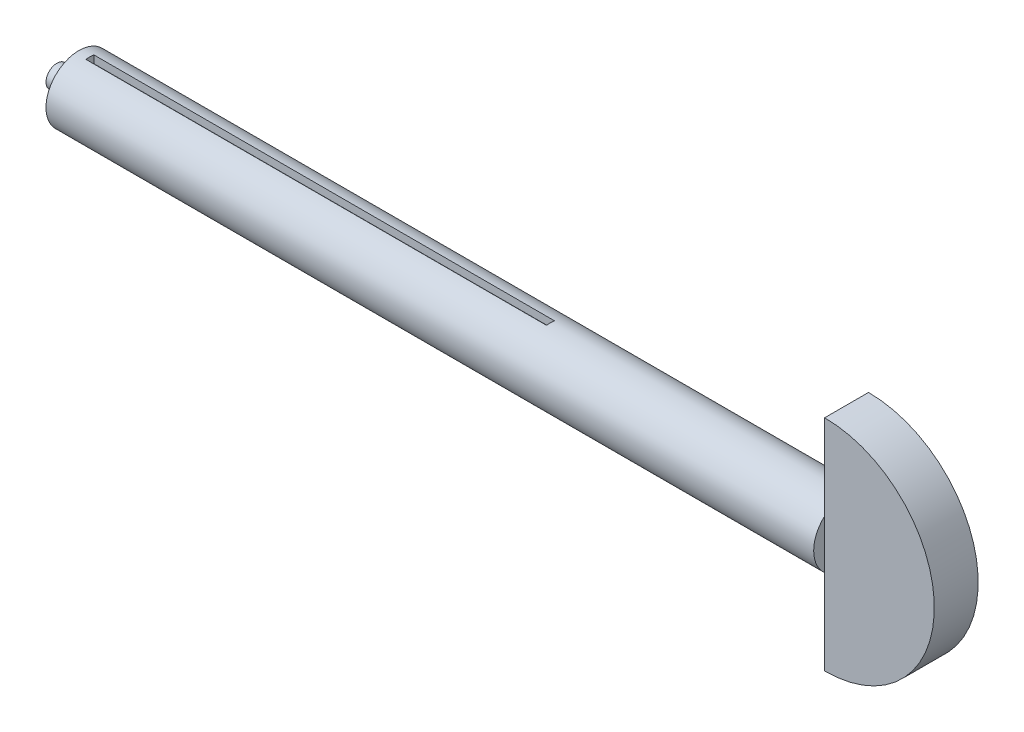
ISO-10303-21;
HEADER;
FILE_DESCRIPTION(('STEP AP214'),'2;1');
FILE_NAME('part.step','',(''),(''),'','','');
FILE_SCHEMA(('AUTOMOTIVE_DESIGN { 1 0 10303 214 1 1 1 1 }'));
ENDSEC;
DATA;
#1=APPLICATION_CONTEXT('core data for automotive mechanical design processes');
#2=APPLICATION_PROTOCOL_DEFINITION('international standard','automotive_design',2000,#1);
#3=PRODUCT_CONTEXT('',#1,'mechanical');
#4=PRODUCT('Part','Part','',(#3));
#5=PRODUCT_RELATED_PRODUCT_CATEGORY('part','',(#4));
#6=PRODUCT_DEFINITION_FORMATION('','',#4);
#7=PRODUCT_DEFINITION_CONTEXT('part definition',#1,'design');
#8=PRODUCT_DEFINITION('design','',#6,#7);
#9=PRODUCT_DEFINITION_SHAPE('','',#8);
#10=(LENGTH_UNIT() NAMED_UNIT(*) SI_UNIT(.MILLI.,.METRE.));
#11=(NAMED_UNIT(*) PLANE_ANGLE_UNIT() SI_UNIT($,.RADIAN.));
#12=(NAMED_UNIT(*) SI_UNIT($,.STERADIAN.) SOLID_ANGLE_UNIT());
#13=UNCERTAINTY_MEASURE_WITH_UNIT(LENGTH_MEASURE(1.E-05),#10,'distance_accuracy_value','');
#14=(GEOMETRIC_REPRESENTATION_CONTEXT(3) GLOBAL_UNCERTAINTY_ASSIGNED_CONTEXT((#13)) GLOBAL_UNIT_ASSIGNED_CONTEXT((#10,
#11,#12)) REPRESENTATION_CONTEXT('',''));
#15=CARTESIAN_POINT('',(0.,0.,0.));
#16=DIRECTION('',(0.,0.,1.));
#17=DIRECTION('',(1.,0.,0.));
#18=AXIS2_PLACEMENT_3D('',#15,#16,#17);
#19=CARTESIAN_POINT('',(180.,0.,0.));
#20=DIRECTION('',(-1.,0.,0.));
#21=DIRECTION('',(0.,0.,1.));
#22=AXIS2_PLACEMENT_3D('',#19,#20,#21);
#23=CYLINDRICAL_SURFACE('',#22,7.5);
#24=DIRECTION('',(-1.,0.,0.));
#25=VECTOR('',#24,1.);
#26=CARTESIAN_POINT('',(180.,-7.44580418759451,0.9));
#27=LINE('',#26,#25);
#28=CARTESIAN_POINT('',(7.5,-7.44580418759451,0.9));
#29=VERTEX_POINT('',#28);
#30=CARTESIAN_POINT('',(112.5,-7.44580418759451,0.9));
#31=VERTEX_POINT('',#30);
#32=EDGE_CURVE('E13',#29,#31,#27,.F.);
#33=ORIENTED_EDGE('',*,*,#32,.T.);
#34=CARTESIAN_POINT('',(112.5,0.,0.));
#35=DIRECTION('',(1.,0.,0.));
#36=DIRECTION('',(0.,0.,-1.));
#37=AXIS2_PLACEMENT_3D('',#34,#35,#36);
#38=CIRCLE('',#37,7.5);
#39=CARTESIAN_POINT('',(112.5,-7.44580418759451,-0.9));
#40=VERTEX_POINT('',#39);
#41=EDGE_CURVE('E66',#31,#40,#38,.T.);
#42=ORIENTED_EDGE('',*,*,#41,.T.);
#43=DIRECTION('',(-1.,0.,0.));
#44=VECTOR('',#43,1.);
#45=CARTESIAN_POINT('',(180.,-7.44580418759451,-0.9));
#46=LINE('',#45,#44);
#47=CARTESIAN_POINT('',(7.5,-7.44580418759451,-0.9));
#48=VERTEX_POINT('',#47);
#49=EDGE_CURVE('E275',#40,#48,#46,.T.);
#50=ORIENTED_EDGE('',*,*,#49,.T.);
#51=CARTESIAN_POINT('',(7.50000000000001,0.,0.));
#52=DIRECTION('',(-1.,0.,0.));
#53=DIRECTION('',(0.,0.,1.));
#54=AXIS2_PLACEMENT_3D('',#51,#52,#53);
#55=CIRCLE('',#54,7.5);
#56=EDGE_CURVE('E59',#48,#29,#55,.T.);
#57=ORIENTED_EDGE('',*,*,#56,.T.);
#58=EDGE_LOOP('',(#33,#42,#50,#57));
#59=FACE_BOUND('',#58,.T.);
#60=CARTESIAN_POINT('',(180.,0.,0.));
#61=DIRECTION('',(1.,0.,0.));
#62=DIRECTION('',(0.,0.,-1.));
#63=AXIS2_PLACEMENT_3D('',#60,#61,#62);
#64=CIRCLE('',#63,7.5);
#65=CARTESIAN_POINT('',(180.,5.59016994374947,-5.));
#66=VERTEX_POINT('',#65);
#67=CARTESIAN_POINT('',(180.,5.59016994374947,5.));
#68=VERTEX_POINT('',#67);
#69=EDGE_CURVE('E236',#66,#68,#64,.T.);
#70=ORIENTED_EDGE('',*,*,#69,.F.);
#71=CARTESIAN_POINT('',(180.,-5.59016994374947,-5.));
#72=VERTEX_POINT('',#71);
#73=EDGE_CURVE('E242',#72,#66,#64,.T.);
#74=ORIENTED_EDGE('',*,*,#73,.F.);
#75=CARTESIAN_POINT('',(180.,-5.59016994374947,5.));
#76=VERTEX_POINT('',#75);
#77=EDGE_CURVE('E374',#76,#72,#64,.T.);
#78=ORIENTED_EDGE('',*,*,#77,.F.);
#79=EDGE_CURVE('E241',#68,#76,#64,.T.);
#80=ORIENTED_EDGE('',*,*,#79,.F.);
#81=EDGE_LOOP('',(#70,#74,#78,#80));
#82=FACE_BOUND('',#81,.T.);
#83=CARTESIAN_POINT('',(5.,0.,0.));
#84=DIRECTION('',(1.,0.,0.));
#85=DIRECTION('',(0.,0.,-1.));
#86=AXIS2_PLACEMENT_3D('',#83,#84,#85);
#87=CIRCLE('',#86,7.5);
#88=CARTESIAN_POINT('',(5.,0.,-7.5));
#89=VERTEX_POINT('',#88);
#90=EDGE_CURVE('E233',#89,#89,#87,.T.);
#91=ORIENTED_EDGE('',*,*,#90,.T.);
#92=EDGE_LOOP('',(#91));
#93=FACE_BOUND('',#92,.T.);
#94=CARTESIAN_POINT('',(112.5,0.,0.));
#95=DIRECTION('',(-1.,0.,0.));
#96=DIRECTION('',(0.,0.,1.));
#97=AXIS2_PLACEMENT_3D('',#94,#95,#96);
#98=CIRCLE('',#97,7.5);
#99=CARTESIAN_POINT('',(112.5,7.44580418759451,0.9));
#100=VERTEX_POINT('',#99);
#101=CARTESIAN_POINT('',(112.5,7.44580418759451,-0.9));
#102=VERTEX_POINT('',#101);
#103=EDGE_CURVE('E260',#100,#102,#98,.T.);
#104=ORIENTED_EDGE('',*,*,#103,.F.);
#105=DIRECTION('',(-1.,0.,0.));
#106=VECTOR('',#105,1.);
#107=CARTESIAN_POINT('',(180.,7.44580418759451,0.9));
#108=LINE('',#107,#106);
#109=CARTESIAN_POINT('',(7.5,7.44580418759451,0.9));
#110=VERTEX_POINT('',#109);
#111=EDGE_CURVE('E269',#110,#100,#108,.F.);
#112=ORIENTED_EDGE('',*,*,#111,.F.);
#113=CARTESIAN_POINT('',(7.50000000000001,0.,0.));
#114=DIRECTION('',(1.,0.,0.));
#115=DIRECTION('',(0.,0.,-1.));
#116=AXIS2_PLACEMENT_3D('',#113,#114,#115);
#117=CIRCLE('',#116,7.5);
#118=CARTESIAN_POINT('',(7.5,7.44580418759451,-0.9));
#119=VERTEX_POINT('',#118);
#120=EDGE_CURVE('E263',#119,#110,#117,.T.);
#121=ORIENTED_EDGE('',*,*,#120,.F.);
#122=DIRECTION('',(-1.,0.,0.));
#123=VECTOR('',#122,1.);
#124=CARTESIAN_POINT('',(180.,7.44580418759451,-0.9));
#125=LINE('',#124,#123);
#126=EDGE_CURVE('E266',#102,#119,#125,.T.);
#127=ORIENTED_EDGE('',*,*,#126,.F.);
#128=EDGE_LOOP('',(#104,#112,#121,#127));
#129=FACE_BOUND('',#128,.T.);
#130=ADVANCED_FACE('F50',(#59,#82,#93,#129),#23,.T.);
#131=CARTESIAN_POINT('',(180.,0.,0.));
#132=DIRECTION('',(1.,0.,0.));
#133=DIRECTION('',(0.,0.,-1.));
#134=AXIS2_PLACEMENT_3D('',#131,#132,#133);
#135=PLANE('',#134);
#136=ORIENTED_EDGE('',*,*,#79,.T.);
#137=DIRECTION('',(0.,1.,0.));
#138=VECTOR('',#137,1.);
#139=CARTESIAN_POINT('',(180.,0.,5.));
#140=LINE('',#139,#138);
#141=EDGE_CURVE('E257',#76,#68,#140,.T.);
#142=ORIENTED_EDGE('',*,*,#141,.T.);
#143=EDGE_LOOP('',(#136,#142));
#144=FACE_BOUND('',#143,.T.);
#145=ADVANCED_FACE('F293',(#144),#135,.T.);
#146=CARTESIAN_POINT('',(5.,0.,0.));
#147=DIRECTION('',(-1.,0.,0.));
#148=DIRECTION('',(0.,0.,1.));
#149=AXIS2_PLACEMENT_3D('',#146,#147,#148);
#150=CYLINDRICAL_SURFACE('',#149,2.5);
#151=CARTESIAN_POINT('',(5.,0.,0.));
#152=DIRECTION('',(1.,0.,0.));
#153=DIRECTION('',(0.,0.,-1.));
#154=AXIS2_PLACEMENT_3D('',#151,#152,#153);
#155=CIRCLE('',#154,2.5);
#156=CARTESIAN_POINT('',(5.,0.,-2.5));
#157=VERTEX_POINT('',#156);
#158=EDGE_CURVE('E246',#157,#157,#155,.T.);
#159=ORIENTED_EDGE('',*,*,#158,.F.);
#160=EDGE_LOOP('',(#159));
#161=FACE_BOUND('',#160,.T.);
#162=CARTESIAN_POINT('',(0.,0.,0.));
#163=DIRECTION('',(1.,0.,0.));
#164=DIRECTION('',(0.,0.,-1.));
#165=AXIS2_PLACEMENT_3D('',#162,#163,#164);
#166=CIRCLE('',#165,2.5);
#167=CARTESIAN_POINT('',(0.,0.,-2.5));
#168=VERTEX_POINT('',#167);
#169=EDGE_CURVE('E240',#168,#168,#166,.T.);
#170=ORIENTED_EDGE('',*,*,#169,.T.);
#171=EDGE_LOOP('',(#170));
#172=FACE_BOUND('',#171,.T.);
#173=ADVANCED_FACE('F52',(#161,#172),#150,.T.);
#174=CARTESIAN_POINT('',(0.,0.,0.));
#175=DIRECTION('',(1.,0.,0.));
#176=DIRECTION('',(0.,0.,-1.));
#177=AXIS2_PLACEMENT_3D('',#174,#175,#176);
#178=PLANE('',#177);
#179=ORIENTED_EDGE('',*,*,#169,.F.);
#180=EDGE_LOOP('',(#179));
#181=FACE_BOUND('',#180,.T.);
#182=ADVANCED_FACE('F303',(#181),#178,.F.);
#183=DIRECTION('',(0.,1.,0.));
#184=VECTOR('',#183,1.);
#185=CARTESIAN_POINT('',(180.,0.,-5.));
#186=LINE('',#185,#184);
#187=EDGE_CURVE('E250',#72,#66,#186,.T.);
#188=ORIENTED_EDGE('',*,*,#187,.F.);
#189=ORIENTED_EDGE('',*,*,#73,.T.);
#190=EDGE_LOOP('',(#188,#189));
#191=FACE_BOUND('',#190,.T.);
#192=ADVANCED_FACE('F300',(#191),#135,.T.);
#193=CARTESIAN_POINT('',(5.,0.,0.));
#194=DIRECTION('',(1.,0.,0.));
#195=DIRECTION('',(0.,0.,-1.));
#196=AXIS2_PLACEMENT_3D('',#193,#194,#195);
#197=PLANE('',#196);
#198=ORIENTED_EDGE('',*,*,#158,.T.);
#199=EDGE_LOOP('',(#198));
#200=FACE_BOUND('',#199,.T.);
#201=ORIENTED_EDGE('',*,*,#90,.F.);
#202=EDGE_LOOP('',(#201));
#203=FACE_BOUND('',#202,.T.);
#204=ADVANCED_FACE('F302',(#200,#203),#197,.F.);
#205=CARTESIAN_POINT('',(180.,-25.,5.));
#206=DIRECTION('',(-1.,0.,0.));
#207=DIRECTION('',(0.,0.,1.));
#208=AXIS2_PLACEMENT_3D('',#205,#206,#207);
#209=PLANE('',#208);
#210=ORIENTED_EDGE('',*,*,#69,.T.);
#211=DIRECTION('',(0.,1.,0.));
#212=VECTOR('',#211,1.);
#213=CARTESIAN_POINT('',(180.,-25.,5.));
#214=LINE('',#213,#212);
#215=CARTESIAN_POINT('',(180.,25.,5.));
#216=VERTEX_POINT('',#215);
#217=EDGE_CURVE('E215',#68,#216,#214,.T.);
#218=ORIENTED_EDGE('',*,*,#217,.T.);
#219=DIRECTION('',(0.,0.,-1.));
#220=VECTOR('',#219,1.);
#221=CARTESIAN_POINT('',(180.,25.,5.));
#222=LINE('',#221,#220);
#223=CARTESIAN_POINT('',(180.,25.,-5.));
#224=VERTEX_POINT('',#223);
#225=EDGE_CURVE('E229',#216,#224,#222,.T.);
#226=ORIENTED_EDGE('',*,*,#225,.T.);
#227=DIRECTION('',(0.,1.,0.));
#228=VECTOR('',#227,1.);
#229=CARTESIAN_POINT('',(180.,-25.,-5.));
#230=LINE('',#229,#228);
#231=EDGE_CURVE('E225',#66,#224,#230,.T.);
#232=ORIENTED_EDGE('',*,*,#231,.F.);
#233=EDGE_LOOP('',(#210,#218,#226,#232));
#234=FACE_BOUND('',#233,.T.);
#235=ADVANCED_FACE('F320',(#234),#209,.T.);
#236=CARTESIAN_POINT('',(180.,0.,5.));
#237=DIRECTION('',(0.,0.,-1.));
#238=DIRECTION('',(-1.,0.,0.));
#239=AXIS2_PLACEMENT_3D('',#236,#237,#238);
#240=CYLINDRICAL_SURFACE('',#239,25.);
#241=CARTESIAN_POINT('',(180.,0.,-5.));
#242=DIRECTION('',(0.,0.,-1.));
#243=DIRECTION('',(-1.,0.,0.));
#244=AXIS2_PLACEMENT_3D('',#241,#242,#243);
#245=CIRCLE('',#244,25.);
#246=CARTESIAN_POINT('',(180.,-25.,-5.));
#247=VERTEX_POINT('',#246);
#248=EDGE_CURVE('E210',#224,#247,#245,.T.);
#249=ORIENTED_EDGE('',*,*,#248,.F.);
#250=ORIENTED_EDGE('',*,*,#225,.F.);
#251=CARTESIAN_POINT('',(180.,0.,5.));
#252=DIRECTION('',(0.,0.,-1.));
#253=DIRECTION('',(-1.,0.,0.));
#254=AXIS2_PLACEMENT_3D('',#251,#252,#253);
#255=CIRCLE('',#254,25.);
#256=CARTESIAN_POINT('',(180.,-25.,5.));
#257=VERTEX_POINT('',#256);
#258=EDGE_CURVE('E211',#216,#257,#255,.T.);
#259=ORIENTED_EDGE('',*,*,#258,.T.);
#260=DIRECTION('',(0.,0.,-1.));
#261=VECTOR('',#260,1.);
#262=CARTESIAN_POINT('',(180.,-25.,5.));
#263=LINE('',#262,#261);
#264=EDGE_CURVE('E221',#257,#247,#263,.T.);
#265=ORIENTED_EDGE('',*,*,#264,.T.);
#266=EDGE_LOOP('',(#249,#250,#259,#265));
#267=FACE_BOUND('',#266,.T.);
#268=ADVANCED_FACE('F360',(#267),#240,.T.);
#269=ORIENTED_EDGE('',*,*,#77,.T.);
#270=EDGE_CURVE('E216',#247,#72,#230,.T.);
#271=ORIENTED_EDGE('',*,*,#270,.F.);
#272=ORIENTED_EDGE('',*,*,#264,.F.);
#273=EDGE_CURVE('E217',#257,#76,#214,.T.);
#274=ORIENTED_EDGE('',*,*,#273,.T.);
#275=EDGE_LOOP('',(#269,#271,#272,#274));
#276=FACE_BOUND('',#275,.T.);
#277=ADVANCED_FACE('F355',(#276),#209,.T.);
#278=CARTESIAN_POINT('',(180.,0.,5.));
#279=DIRECTION('',(0.,0.,-1.));
#280=DIRECTION('',(-1.,0.,0.));
#281=AXIS2_PLACEMENT_3D('',#278,#279,#280);
#282=PLANE('',#281);
#283=ORIENTED_EDGE('',*,*,#258,.F.);
#284=ORIENTED_EDGE('',*,*,#217,.F.);
#285=ORIENTED_EDGE('',*,*,#141,.F.);
#286=ORIENTED_EDGE('',*,*,#273,.F.);
#287=EDGE_LOOP('',(#283,#284,#285,#286));
#288=FACE_BOUND('',#287,.T.);
#289=ADVANCED_FACE('F349',(#288),#282,.F.);
#290=CARTESIAN_POINT('',(180.,0.,-5.));
#291=DIRECTION('',(0.,0.,-1.));
#292=DIRECTION('',(-1.,0.,0.));
#293=AXIS2_PLACEMENT_3D('',#290,#291,#292);
#294=PLANE('',#293);
#295=ORIENTED_EDGE('',*,*,#248,.T.);
#296=ORIENTED_EDGE('',*,*,#270,.T.);
#297=ORIENTED_EDGE('',*,*,#187,.T.);
#298=ORIENTED_EDGE('',*,*,#231,.T.);
#299=EDGE_LOOP('',(#295,#296,#297,#298));
#300=FACE_BOUND('',#299,.T.);
#301=ADVANCED_FACE('F342',(#300),#294,.T.);
#302=CARTESIAN_POINT('',(7.5,7.5,-0.9));
#303=DIRECTION('',(1.,0.,0.));
#304=DIRECTION('',(0.,0.,-1.));
#305=AXIS2_PLACEMENT_3D('',#302,#303,#304);
#306=PLANE('',#305);
#307=DIRECTION('',(0.,-1.,0.));
#308=VECTOR('',#307,1.);
#309=CARTESIAN_POINT('',(7.5,7.5,-0.9));
#310=LINE('',#309,#308);
#311=CARTESIAN_POINT('',(7.5,5.7,-0.9));
#312=VERTEX_POINT('',#311);
#313=EDGE_CURVE('E199',#119,#312,#310,.T.);
#314=ORIENTED_EDGE('',*,*,#313,.F.);
#315=ORIENTED_EDGE('',*,*,#120,.T.);
#316=DIRECTION('',(0.,-1.,0.));
#317=VECTOR('',#316,1.);
#318=CARTESIAN_POINT('',(7.5,7.5,0.9));
#319=LINE('',#318,#317);
#320=CARTESIAN_POINT('',(7.5,5.7,0.9));
#321=VERTEX_POINT('',#320);
#322=EDGE_CURVE('E207',#110,#321,#319,.T.);
#323=ORIENTED_EDGE('',*,*,#322,.T.);
#324=DIRECTION('',(0.,0.,1.));
#325=VECTOR('',#324,1.);
#326=CARTESIAN_POINT('',(7.5,5.7,-0.9));
#327=LINE('',#326,#325);
#328=EDGE_CURVE('E153',#312,#321,#327,.T.);
#329=ORIENTED_EDGE('',*,*,#328,.F.);
#330=EDGE_LOOP('',(#314,#315,#323,#329));
#331=FACE_BOUND('',#330,.T.);
#332=ADVANCED_FACE('F340',(#331),#306,.T.);
#333=CARTESIAN_POINT('',(7.5,7.5,0.9));
#334=DIRECTION('',(0.,0.,-1.));
#335=DIRECTION('',(-1.,0.,0.));
#336=AXIS2_PLACEMENT_3D('',#333,#334,#335);
#337=PLANE('',#336);
#338=ORIENTED_EDGE('',*,*,#111,.T.);
#339=DIRECTION('',(0.,-1.,0.));
#340=VECTOR('',#339,1.);
#341=CARTESIAN_POINT('',(112.5,7.5,0.9));
#342=LINE('',#341,#340);
#343=CARTESIAN_POINT('',(112.5,5.7,0.9));
#344=VERTEX_POINT('',#343);
#345=EDGE_CURVE('E204',#100,#344,#342,.T.);
#346=ORIENTED_EDGE('',*,*,#345,.T.);
#347=DIRECTION('',(1.,0.,0.));
#348=VECTOR('',#347,1.);
#349=CARTESIAN_POINT('',(7.5,5.7,0.9));
#350=LINE('',#349,#348);
#351=EDGE_CURVE('E187',#321,#344,#350,.T.);
#352=ORIENTED_EDGE('',*,*,#351,.F.);
#353=ORIENTED_EDGE('',*,*,#322,.F.);
#354=EDGE_LOOP('',(#338,#346,#352,#353));
#355=FACE_BOUND('',#354,.T.);
#356=ADVANCED_FACE('F330',(#355),#337,.T.);
#357=CARTESIAN_POINT('',(112.5,7.5,-0.9));
#358=DIRECTION('',(-1.,0.,0.));
#359=DIRECTION('',(0.,0.,1.));
#360=AXIS2_PLACEMENT_3D('',#357,#358,#359);
#361=PLANE('',#360);
#362=ORIENTED_EDGE('',*,*,#345,.F.);
#363=ORIENTED_EDGE('',*,*,#103,.T.);
#364=DIRECTION('',(0.,-1.,0.));
#365=VECTOR('',#364,1.);
#366=CARTESIAN_POINT('',(112.5,7.5,-0.9));
#367=LINE('',#366,#365);
#368=CARTESIAN_POINT('',(112.5,5.7,-0.9));
#369=VERTEX_POINT('',#368);
#370=EDGE_CURVE('E74',#102,#369,#367,.T.);
#371=ORIENTED_EDGE('',*,*,#370,.T.);
#372=DIRECTION('',(0.,0.,-1.));
#373=VECTOR('',#372,1.);
#374=CARTESIAN_POINT('',(112.5,5.7,-0.9));
#375=LINE('',#374,#373);
#376=EDGE_CURVE('E191',#344,#369,#375,.T.);
#377=ORIENTED_EDGE('',*,*,#376,.F.);
#378=EDGE_LOOP('',(#362,#363,#371,#377));
#379=FACE_BOUND('',#378,.T.);
#380=ADVANCED_FACE('F333',(#379),#361,.T.);
#381=CARTESIAN_POINT('',(7.5,7.5,-0.9));
#382=DIRECTION('',(0.,0.,1.));
#383=DIRECTION('',(1.,0.,0.));
#384=AXIS2_PLACEMENT_3D('',#381,#382,#383);
#385=PLANE('',#384);
#386=ORIENTED_EDGE('',*,*,#126,.T.);
#387=ORIENTED_EDGE('',*,*,#313,.T.);
#388=DIRECTION('',(-1.,0.,0.));
#389=VECTOR('',#388,1.);
#390=CARTESIAN_POINT('',(7.5,5.7,-0.9));
#391=LINE('',#390,#389);
#392=EDGE_CURVE('E195',#369,#312,#391,.T.);
#393=ORIENTED_EDGE('',*,*,#392,.F.);
#394=ORIENTED_EDGE('',*,*,#370,.F.);
#395=EDGE_LOOP('',(#386,#387,#393,#394));
#396=FACE_BOUND('',#395,.T.);
#397=ADVANCED_FACE('F337',(#396),#385,.T.);
#398=CARTESIAN_POINT('',(0.,5.7,0.));
#399=DIRECTION('',(0.,1.,0.));
#400=DIRECTION('',(0.,0.,1.));
#401=AXIS2_PLACEMENT_3D('',#398,#399,#400);
#402=PLANE('',#401);
#403=ORIENTED_EDGE('',*,*,#328,.T.);
#404=ORIENTED_EDGE('',*,*,#351,.T.);
#405=ORIENTED_EDGE('',*,*,#376,.T.);
#406=ORIENTED_EDGE('',*,*,#392,.T.);
#407=EDGE_LOOP('',(#403,#404,#405,#406));
#408=FACE_BOUND('',#407,.T.);
#409=ADVANCED_FACE('F335',(#408),#402,.T.);
#410=CARTESIAN_POINT('',(7.5,-7.5,-0.9));
#411=DIRECTION('',(-1.,0.,0.));
#412=DIRECTION('',(0.,0.,1.));
#413=AXIS2_PLACEMENT_3D('',#410,#411,#412);
#414=PLANE('',#413);
#415=DIRECTION('',(0.,1.,0.));
#416=VECTOR('',#415,1.);
#417=CARTESIAN_POINT('',(7.5,-7.5,-0.9));
#418=LINE('',#417,#416);
#419=CARTESIAN_POINT('',(7.5,-5.7,-0.9));
#420=VERTEX_POINT('',#419);
#421=EDGE_CURVE('E142',#48,#420,#418,.T.);
#422=ORIENTED_EDGE('',*,*,#421,.T.);
#423=DIRECTION('',(0.,0.,1.));
#424=VECTOR('',#423,1.);
#425=CARTESIAN_POINT('',(7.5,-5.7,-0.9));
#426=LINE('',#425,#424);
#427=CARTESIAN_POINT('',(7.5,-5.7,0.9));
#428=VERTEX_POINT('',#427);
#429=EDGE_CURVE('E146',#420,#428,#426,.T.);
#430=ORIENTED_EDGE('',*,*,#429,.T.);
#431=DIRECTION('',(0.,1.,0.));
#432=VECTOR('',#431,1.);
#433=CARTESIAN_POINT('',(7.5,-7.5,0.9));
#434=LINE('',#433,#432);
#435=EDGE_CURVE('E176',#29,#428,#434,.T.);
#436=ORIENTED_EDGE('',*,*,#435,.F.);
#437=ORIENTED_EDGE('',*,*,#56,.F.);
#438=EDGE_LOOP('',(#422,#430,#436,#437));
#439=FACE_BOUND('',#438,.T.);
#440=ADVANCED_FACE('F144',(#439),#414,.F.);
#441=CARTESIAN_POINT('',(7.5,-7.5,-0.9));
#442=DIRECTION('',(0.,0.,-1.));
#443=DIRECTION('',(-1.,0.,0.));
#444=AXIS2_PLACEMENT_3D('',#441,#442,#443);
#445=PLANE('',#444);
#446=DIRECTION('',(0.,1.,0.));
#447=VECTOR('',#446,1.);
#448=CARTESIAN_POINT('',(112.5,-7.5,-0.9));
#449=LINE('',#448,#447);
#450=CARTESIAN_POINT('',(112.5,-5.7,-0.9));
#451=VERTEX_POINT('',#450);
#452=EDGE_CURVE('E154',#40,#451,#449,.T.);
#453=ORIENTED_EDGE('',*,*,#452,.T.);
#454=DIRECTION('',(-1.,0.,0.));
#455=VECTOR('',#454,1.);
#456=CARTESIAN_POINT('',(7.5,-5.7,-0.9));
#457=LINE('',#456,#455);
#458=EDGE_CURVE('E160',#451,#420,#457,.T.);
#459=ORIENTED_EDGE('',*,*,#458,.T.);
#460=ORIENTED_EDGE('',*,*,#421,.F.);
#461=ORIENTED_EDGE('',*,*,#49,.F.);
#462=EDGE_LOOP('',(#453,#459,#460,#461));
#463=FACE_BOUND('',#462,.T.);
#464=ADVANCED_FACE('F166',(#463),#445,.F.);
#465=CARTESIAN_POINT('',(112.5,-7.5,-0.9));
#466=DIRECTION('',(1.,0.,0.));
#467=DIRECTION('',(0.,0.,-1.));
#468=AXIS2_PLACEMENT_3D('',#465,#466,#467);
#469=PLANE('',#468);
#470=DIRECTION('',(0.,1.,0.));
#471=VECTOR('',#470,1.);
#472=CARTESIAN_POINT('',(112.5,-7.5,0.9));
#473=LINE('',#472,#471);
#474=CARTESIAN_POINT('',(112.5,-5.7,0.9));
#475=VERTEX_POINT('',#474);
#476=EDGE_CURVE('E179',#31,#475,#473,.T.);
#477=ORIENTED_EDGE('',*,*,#476,.T.);
#478=DIRECTION('',(0.,0.,-1.));
#479=VECTOR('',#478,1.);
#480=CARTESIAN_POINT('',(112.5,-5.7,-0.9));
#481=LINE('',#480,#479);
#482=EDGE_CURVE('E168',#475,#451,#481,.T.);
#483=ORIENTED_EDGE('',*,*,#482,.T.);
#484=ORIENTED_EDGE('',*,*,#452,.F.);
#485=ORIENTED_EDGE('',*,*,#41,.F.);
#486=EDGE_LOOP('',(#477,#483,#484,#485));
#487=FACE_BOUND('',#486,.T.);
#488=ADVANCED_FACE('F281',(#487),#469,.F.);
#489=CARTESIAN_POINT('',(7.5,-7.5,0.9));
#490=DIRECTION('',(0.,0.,1.));
#491=DIRECTION('',(1.,0.,0.));
#492=AXIS2_PLACEMENT_3D('',#489,#490,#491);
#493=PLANE('',#492);
#494=ORIENTED_EDGE('',*,*,#435,.T.);
#495=DIRECTION('',(1.,0.,0.));
#496=VECTOR('',#495,1.);
#497=CARTESIAN_POINT('',(7.5,-5.7,0.9));
#498=LINE('',#497,#496);
#499=EDGE_CURVE('E163',#428,#475,#498,.T.);
#500=ORIENTED_EDGE('',*,*,#499,.T.);
#501=ORIENTED_EDGE('',*,*,#476,.F.);
#502=ORIENTED_EDGE('',*,*,#32,.F.);
#503=EDGE_LOOP('',(#494,#500,#501,#502));
#504=FACE_BOUND('',#503,.T.);
#505=ADVANCED_FACE('F283',(#504),#493,.F.);
#506=CARTESIAN_POINT('',(0.,-5.7,0.));
#507=DIRECTION('',(0.,-1.,0.));
#508=DIRECTION('',(0.,0.,1.));
#509=AXIS2_PLACEMENT_3D('',#506,#507,#508);
#510=PLANE('',#509);
#511=ORIENTED_EDGE('',*,*,#429,.F.);
#512=ORIENTED_EDGE('',*,*,#458,.F.);
#513=ORIENTED_EDGE('',*,*,#482,.F.);
#514=ORIENTED_EDGE('',*,*,#499,.F.);
#515=EDGE_LOOP('',(#511,#512,#513,#514));
#516=FACE_BOUND('',#515,.T.);
#517=ADVANCED_FACE('F158',(#516),#510,.T.);
#518=CLOSED_SHELL('',(#130,#145,#173,#182,#192,#204,#235,#268,#277,#289,#301,#332,#356,#380,
#397,#409,#440,#464,#488,#505,#517));
#519=MANIFOLD_SOLID_BREP('B2',#518);
#520=ADVANCED_BREP_SHAPE_REPRESENTATION('',(#18,#519),#14);
#521=SHAPE_DEFINITION_REPRESENTATION(#9,#520);
ENDSEC;
END-ISO-10303-21;
